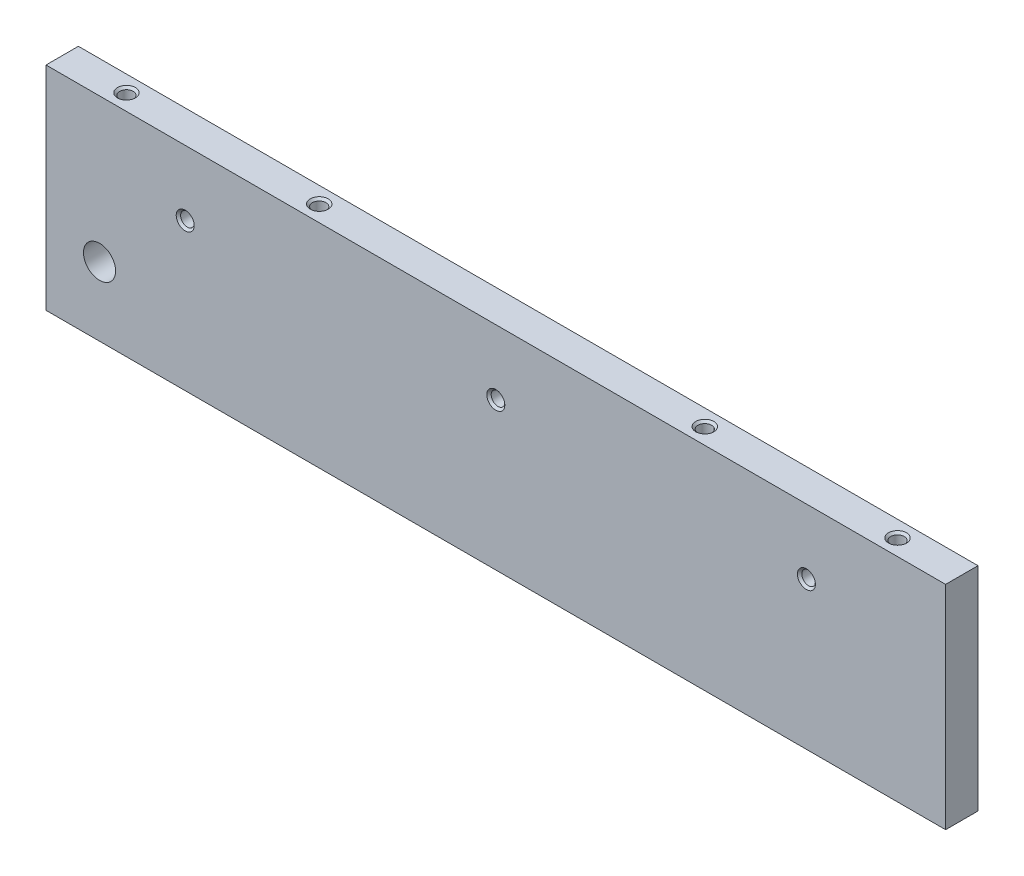
ISO-10303-21;
HEADER;
FILE_DESCRIPTION(('STEP AP214'),'2;1');
FILE_NAME('part.step','',(''),(''),'','','');
FILE_SCHEMA(('AUTOMOTIVE_DESIGN { 1 0 10303 214 1 1 1 1 }'));
ENDSEC;
DATA;
#1=APPLICATION_CONTEXT('core data for automotive mechanical design processes');
#2=APPLICATION_PROTOCOL_DEFINITION('international standard','automotive_design',2000,#1);
#3=PRODUCT_CONTEXT('',#1,'mechanical');
#4=PRODUCT('Part','Part','',(#3));
#5=PRODUCT_RELATED_PRODUCT_CATEGORY('part','',(#4));
#6=PRODUCT_DEFINITION_FORMATION('','',#4);
#7=PRODUCT_DEFINITION_CONTEXT('part definition',#1,'design');
#8=PRODUCT_DEFINITION('design','',#6,#7);
#9=PRODUCT_DEFINITION_SHAPE('','',#8);
#10=(LENGTH_UNIT() NAMED_UNIT(*) SI_UNIT(.MILLI.,.METRE.));
#11=(NAMED_UNIT(*) PLANE_ANGLE_UNIT() SI_UNIT($,.RADIAN.));
#12=(NAMED_UNIT(*) SI_UNIT($,.STERADIAN.) SOLID_ANGLE_UNIT());
#13=UNCERTAINTY_MEASURE_WITH_UNIT(LENGTH_MEASURE(1.E-05),#10,'distance_accuracy_value','');
#14=(GEOMETRIC_REPRESENTATION_CONTEXT(3) GLOBAL_UNCERTAINTY_ASSIGNED_CONTEXT((#13)) GLOBAL_UNIT_ASSIGNED_CONTEXT((#10,
#11,#12)) REPRESENTATION_CONTEXT('',''));
#15=CARTESIAN_POINT('',(0.,0.,0.));
#16=DIRECTION('',(0.,0.,1.));
#17=DIRECTION('',(1.,0.,0.));
#18=AXIS2_PLACEMENT_3D('',#15,#16,#17);
#19=CARTESIAN_POINT('',(-133.35,0.,9.6012));
#20=DIRECTION('',(1.,0.,0.));
#21=DIRECTION('',(0.,0.,-1.));
#22=AXIS2_PLACEMENT_3D('',#19,#20,#21);
#23=PLANE('',#22);
#24=DIRECTION('',(0.,-1.,0.));
#25=VECTOR('',#24,1.);
#26=CARTESIAN_POINT('',(-133.35,0.,0.));
#27=LINE('',#26,#25);
#28=CARTESIAN_POINT('',(-133.35,0.,0.));
#29=VERTEX_POINT('',#28);
#30=CARTESIAN_POINT('',(-133.35,-62.992,0.));
#31=VERTEX_POINT('',#30);
#32=EDGE_CURVE('E180',#29,#31,#27,.T.);
#33=ORIENTED_EDGE('',*,*,#32,.T.);
#34=DIRECTION('',(0.,0.,-1.));
#35=VECTOR('',#34,1.);
#36=CARTESIAN_POINT('',(-133.35,-62.992,9.6012));
#37=LINE('',#36,#35);
#38=CARTESIAN_POINT('',(-133.35,-62.992,9.6012));
#39=VERTEX_POINT('',#38);
#40=EDGE_CURVE('E11',#39,#31,#37,.T.);
#41=ORIENTED_EDGE('',*,*,#40,.F.);
#42=DIRECTION('',(0.,-1.,0.));
#43=VECTOR('',#42,1.);
#44=CARTESIAN_POINT('',(-133.35,0.,9.6012));
#45=LINE('',#44,#43);
#46=CARTESIAN_POINT('',(-133.35,0.,9.6012));
#47=VERTEX_POINT('',#46);
#48=EDGE_CURVE('E181',#47,#39,#45,.T.);
#49=ORIENTED_EDGE('',*,*,#48,.F.);
#50=DIRECTION('',(0.,0.,-1.));
#51=VECTOR('',#50,1.);
#52=CARTESIAN_POINT('',(-133.35,0.,9.6012));
#53=LINE('',#52,#51);
#54=EDGE_CURVE('E187',#47,#29,#53,.T.);
#55=ORIENTED_EDGE('',*,*,#54,.T.);
#56=EDGE_LOOP('',(#33,#41,#49,#55));
#57=FACE_BOUND('',#56,.T.);
#58=ADVANCED_FACE('F34',(#57),#23,.F.);
#59=CARTESIAN_POINT('',(-133.35,-62.992,9.6012));
#60=DIRECTION('',(0.,1.,0.));
#61=DIRECTION('',(0.,0.,1.));
#62=AXIS2_PLACEMENT_3D('',#59,#60,#61);
#63=PLANE('',#62);
#64=DIRECTION('',(1.,0.,0.));
#65=VECTOR('',#64,1.);
#66=CARTESIAN_POINT('',(-133.35,-62.992,0.));
#67=LINE('',#66,#65);
#68=CARTESIAN_POINT('',(133.35,-62.992,0.));
#69=VERTEX_POINT('',#68);
#70=EDGE_CURVE('E190',#31,#69,#67,.T.);
#71=ORIENTED_EDGE('',*,*,#70,.T.);
#72=DIRECTION('',(0.,0.,-1.));
#73=VECTOR('',#72,1.);
#74=CARTESIAN_POINT('',(133.35,-62.992,9.6012));
#75=LINE('',#74,#73);
#76=CARTESIAN_POINT('',(133.35,-62.992,9.6012));
#77=VERTEX_POINT('',#76);
#78=EDGE_CURVE('E42',#77,#69,#75,.T.);
#79=ORIENTED_EDGE('',*,*,#78,.F.);
#80=DIRECTION('',(1.,0.,0.));
#81=VECTOR('',#80,1.);
#82=CARTESIAN_POINT('',(-133.35,-62.992,9.6012));
#83=LINE('',#82,#81);
#84=EDGE_CURVE('E81',#39,#77,#83,.T.);
#85=ORIENTED_EDGE('',*,*,#84,.F.);
#86=ORIENTED_EDGE('',*,*,#40,.T.);
#87=EDGE_LOOP('',(#71,#79,#85,#86));
#88=FACE_BOUND('',#87,.T.);
#89=ADVANCED_FACE('F215',(#88),#63,.F.);
#90=CARTESIAN_POINT('',(133.35,0.,9.6012));
#91=DIRECTION('',(-1.,0.,0.));
#92=DIRECTION('',(0.,0.,1.));
#93=AXIS2_PLACEMENT_3D('',#90,#91,#92);
#94=PLANE('',#93);
#95=DIRECTION('',(0.,1.,0.));
#96=VECTOR('',#95,1.);
#97=CARTESIAN_POINT('',(133.35,0.,0.));
#98=LINE('',#97,#96);
#99=CARTESIAN_POINT('',(133.35,0.,0.));
#100=VERTEX_POINT('',#99);
#101=EDGE_CURVE('E68',#69,#100,#98,.T.);
#102=ORIENTED_EDGE('',*,*,#101,.T.);
#103=DIRECTION('',(0.,0.,-1.));
#104=VECTOR('',#103,1.);
#105=CARTESIAN_POINT('',(133.35,0.,9.6012));
#106=LINE('',#105,#104);
#107=CARTESIAN_POINT('',(133.35,0.,9.6012));
#108=VERTEX_POINT('',#107);
#109=EDGE_CURVE('E195',#108,#100,#106,.T.);
#110=ORIENTED_EDGE('',*,*,#109,.F.);
#111=DIRECTION('',(0.,1.,0.));
#112=VECTOR('',#111,1.);
#113=CARTESIAN_POINT('',(133.35,0.,9.6012));
#114=LINE('',#113,#112);
#115=EDGE_CURVE('E184',#77,#108,#114,.T.);
#116=ORIENTED_EDGE('',*,*,#115,.F.);
#117=ORIENTED_EDGE('',*,*,#78,.T.);
#118=EDGE_LOOP('',(#102,#110,#116,#117));
#119=FACE_BOUND('',#118,.T.);
#120=ADVANCED_FACE('F197',(#119),#94,.F.);
#121=CARTESIAN_POINT('',(-133.35,0.,9.6012));
#122=DIRECTION('',(0.,-1.,0.));
#123=DIRECTION('',(0.,0.,-1.));
#124=AXIS2_PLACEMENT_3D('',#121,#122,#123);
#125=PLANE('',#124);
#126=CARTESIAN_POINT('',(114.3,0.,4.8006));
#127=DIRECTION('',(0.,1.,0.));
#128=DIRECTION('',(0.,0.,1.));
#129=AXIS2_PLACEMENT_3D('',#126,#127,#128);
#130=CIRCLE('',#129,2.667);
#131=CARTESIAN_POINT('',(114.3,0.,7.4676));
#132=VERTEX_POINT('',#131);
#133=EDGE_CURVE('E111',#132,#132,#130,.T.);
#134=ORIENTED_EDGE('',*,*,#133,.F.);
#135=EDGE_LOOP('',(#134));
#136=FACE_BOUND('',#135,.T.);
#137=CARTESIAN_POINT('',(57.15,0.,4.8006));
#138=DIRECTION('',(0.,1.,0.));
#139=DIRECTION('',(0.,0.,1.));
#140=AXIS2_PLACEMENT_3D('',#137,#138,#139);
#141=CIRCLE('',#140,2.667);
#142=CARTESIAN_POINT('',(57.15,0.,7.4676));
#143=VERTEX_POINT('',#142);
#144=EDGE_CURVE('E104',#143,#143,#141,.T.);
#145=ORIENTED_EDGE('',*,*,#144,.F.);
#146=EDGE_LOOP('',(#145));
#147=FACE_BOUND('',#146,.T.);
#148=CARTESIAN_POINT('',(-57.15,0.,4.8006));
#149=DIRECTION('',(0.,1.,0.));
#150=DIRECTION('',(0.,0.,1.));
#151=AXIS2_PLACEMENT_3D('',#148,#149,#150);
#152=CIRCLE('',#151,2.667);
#153=CARTESIAN_POINT('',(-57.15,0.,7.4676));
#154=VERTEX_POINT('',#153);
#155=EDGE_CURVE('E120',#154,#154,#152,.T.);
#156=ORIENTED_EDGE('',*,*,#155,.F.);
#157=EDGE_LOOP('',(#156));
#158=FACE_BOUND('',#157,.T.);
#159=CARTESIAN_POINT('',(-114.3,0.,4.8006));
#160=DIRECTION('',(0.,1.,0.));
#161=DIRECTION('',(0.,0.,1.));
#162=AXIS2_PLACEMENT_3D('',#159,#160,#161);
#163=CIRCLE('',#162,2.667);
#164=CARTESIAN_POINT('',(-114.3,0.,7.4676));
#165=VERTEX_POINT('',#164);
#166=EDGE_CURVE('E129',#165,#165,#163,.T.);
#167=ORIENTED_EDGE('',*,*,#166,.F.);
#168=EDGE_LOOP('',(#167));
#169=FACE_BOUND('',#168,.T.);
#170=DIRECTION('',(-1.,0.,0.));
#171=VECTOR('',#170,1.);
#172=CARTESIAN_POINT('',(-133.35,0.,0.));
#173=LINE('',#172,#171);
#174=EDGE_CURVE('E74',#100,#29,#173,.T.);
#175=ORIENTED_EDGE('',*,*,#174,.T.);
#176=ORIENTED_EDGE('',*,*,#54,.F.);
#177=DIRECTION('',(-1.,0.,0.));
#178=VECTOR('',#177,1.);
#179=CARTESIAN_POINT('',(-133.35,0.,9.6012));
#180=LINE('',#179,#178);
#181=EDGE_CURVE('E50',#108,#47,#180,.T.);
#182=ORIENTED_EDGE('',*,*,#181,.F.);
#183=ORIENTED_EDGE('',*,*,#109,.T.);
#184=EDGE_LOOP('',(#175,#176,#182,#183));
#185=FACE_BOUND('',#184,.T.);
#186=ADVANCED_FACE('F204',(#136,#147,#158,#169,#185),#125,.F.);
#187=CARTESIAN_POINT('',(0.,0.,9.6012));
#188=DIRECTION('',(0.,0.,1.));
#189=DIRECTION('',(1.,0.,0.));
#190=AXIS2_PLACEMENT_3D('',#187,#188,#189);
#191=PLANE('',#190);
#192=CARTESIAN_POINT('',(-117.475,-42.5958,9.6012));
#193=DIRECTION('',(0.,0.,1.));
#194=DIRECTION('',(1.,0.,0.));
#195=AXIS2_PLACEMENT_3D('',#192,#193,#194);
#196=CIRCLE('',#195,4.76249999999999);
#197=CARTESIAN_POINT('',(-112.7125,-42.5958,9.6012));
#198=VERTEX_POINT('',#197);
#199=EDGE_CURVE('E138',#198,#198,#196,.T.);
#200=ORIENTED_EDGE('',*,*,#199,.F.);
#201=EDGE_LOOP('',(#200));
#202=FACE_BOUND('',#201,.T.);
#203=CARTESIAN_POINT('',(92.075,-19.304,9.6012));
#204=DIRECTION('',(0.,0.,1.));
#205=DIRECTION('',(1.,0.,0.));
#206=AXIS2_PLACEMENT_3D('',#203,#204,#205);
#207=CIRCLE('',#206,2.667);
#208=CARTESIAN_POINT('',(94.742,-19.304,9.6012));
#209=VERTEX_POINT('',#208);
#210=EDGE_CURVE('E147',#209,#209,#207,.T.);
#211=ORIENTED_EDGE('',*,*,#210,.F.);
#212=EDGE_LOOP('',(#211));
#213=FACE_BOUND('',#212,.T.);
#214=CARTESIAN_POINT('',(0.,-19.304,9.6012));
#215=DIRECTION('',(0.,0.,1.));
#216=DIRECTION('',(1.,0.,0.));
#217=AXIS2_PLACEMENT_3D('',#214,#215,#216);
#218=CIRCLE('',#217,2.667);
#219=CARTESIAN_POINT('',(2.667,-19.304,9.6012));
#220=VERTEX_POINT('',#219);
#221=EDGE_CURVE('E159',#220,#220,#218,.T.);
#222=ORIENTED_EDGE('',*,*,#221,.F.);
#223=EDGE_LOOP('',(#222));
#224=FACE_BOUND('',#223,.T.);
#225=CARTESIAN_POINT('',(-92.075,-19.304,9.6012));
#226=DIRECTION('',(0.,0.,1.));
#227=DIRECTION('',(1.,0.,0.));
#228=AXIS2_PLACEMENT_3D('',#225,#226,#227);
#229=CIRCLE('',#228,2.667);
#230=CARTESIAN_POINT('',(-89.408,-19.304,9.6012));
#231=VERTEX_POINT('',#230);
#232=EDGE_CURVE('E171',#231,#231,#229,.T.);
#233=ORIENTED_EDGE('',*,*,#232,.F.);
#234=EDGE_LOOP('',(#233));
#235=FACE_BOUND('',#234,.T.);
#236=ORIENTED_EDGE('',*,*,#48,.T.);
#237=ORIENTED_EDGE('',*,*,#84,.T.);
#238=ORIENTED_EDGE('',*,*,#115,.T.);
#239=ORIENTED_EDGE('',*,*,#181,.T.);
#240=EDGE_LOOP('',(#236,#237,#238,#239));
#241=FACE_BOUND('',#240,.T.);
#242=ADVANCED_FACE('F206',(#202,#213,#224,#235,#241),#191,.T.);
#243=CARTESIAN_POINT('',(0.,0.,0.));
#244=DIRECTION('',(0.,0.,1.));
#245=DIRECTION('',(1.,0.,0.));
#246=AXIS2_PLACEMENT_3D('',#243,#244,#245);
#247=PLANE('',#246);
#248=CARTESIAN_POINT('',(-117.475,-42.5958,0.));
#249=DIRECTION('',(0.,0.,1.));
#250=DIRECTION('',(1.,0.,0.));
#251=AXIS2_PLACEMENT_3D('',#248,#249,#250);
#252=CIRCLE('',#251,4.7625);
#253=CARTESIAN_POINT('',(-112.7125,-42.5958,0.));
#254=VERTEX_POINT('',#253);
#255=EDGE_CURVE('E141',#254,#254,#252,.T.);
#256=ORIENTED_EDGE('',*,*,#255,.T.);
#257=EDGE_LOOP('',(#256));
#258=FACE_BOUND('',#257,.T.);
#259=CARTESIAN_POINT('',(92.075,-19.304,0.));
#260=DIRECTION('',(0.,0.,1.));
#261=DIRECTION('',(1.,0.,0.));
#262=AXIS2_PLACEMENT_3D('',#259,#260,#261);
#263=CIRCLE('',#262,2.667);
#264=CARTESIAN_POINT('',(94.742,-19.304,0.));
#265=VERTEX_POINT('',#264);
#266=EDGE_CURVE('E144',#265,#265,#263,.T.);
#267=ORIENTED_EDGE('',*,*,#266,.T.);
#268=EDGE_LOOP('',(#267));
#269=FACE_BOUND('',#268,.T.);
#270=CARTESIAN_POINT('',(0.,-19.304,0.));
#271=DIRECTION('',(0.,0.,1.));
#272=DIRECTION('',(1.,0.,0.));
#273=AXIS2_PLACEMENT_3D('',#270,#271,#272);
#274=CIRCLE('',#273,2.667);
#275=CARTESIAN_POINT('',(2.667,-19.304,0.));
#276=VERTEX_POINT('',#275);
#277=EDGE_CURVE('E156',#276,#276,#274,.T.);
#278=ORIENTED_EDGE('',*,*,#277,.T.);
#279=EDGE_LOOP('',(#278));
#280=FACE_BOUND('',#279,.T.);
#281=CARTESIAN_POINT('',(-92.075,-19.304,0.));
#282=DIRECTION('',(0.,0.,1.));
#283=DIRECTION('',(1.,0.,0.));
#284=AXIS2_PLACEMENT_3D('',#281,#282,#283);
#285=CIRCLE('',#284,2.667);
#286=CARTESIAN_POINT('',(-89.408,-19.304,0.));
#287=VERTEX_POINT('',#286);
#288=EDGE_CURVE('E168',#287,#287,#285,.T.);
#289=ORIENTED_EDGE('',*,*,#288,.T.);
#290=EDGE_LOOP('',(#289));
#291=FACE_BOUND('',#290,.T.);
#292=ORIENTED_EDGE('',*,*,#32,.F.);
#293=ORIENTED_EDGE('',*,*,#174,.F.);
#294=ORIENTED_EDGE('',*,*,#101,.F.);
#295=ORIENTED_EDGE('',*,*,#70,.F.);
#296=EDGE_LOOP('',(#292,#293,#294,#295));
#297=FACE_BOUND('',#296,.T.);
#298=ADVANCED_FACE('F200',(#258,#269,#280,#291,#297),#247,.F.);
#299=CARTESIAN_POINT('',(-92.075,-19.304,0.647700000000003));
#300=DIRECTION('',(0.,0.,-1.));
#301=DIRECTION('',(-1.,0.,0.));
#302=AXIS2_PLACEMENT_3D('',#299,#300,#301);
#303=CONICAL_SURFACE('',#302,2.0193,0.785398163397448);
#304=ORIENTED_EDGE('',*,*,#288,.F.);
#305=EDGE_LOOP('',(#304));
#306=FACE_BOUND('',#305,.T.);
#307=CARTESIAN_POINT('',(-92.075,-19.304,0.647700000000003));
#308=DIRECTION('',(0.,0.,1.));
#309=DIRECTION('',(1.,0.,0.));
#310=AXIS2_PLACEMENT_3D('',#307,#308,#309);
#311=CIRCLE('',#310,2.0193);
#312=CARTESIAN_POINT('',(-90.0557,-19.304,0.647700000000003));
#313=VERTEX_POINT('',#312);
#314=EDGE_CURVE('E177',#313,#313,#311,.T.);
#315=ORIENTED_EDGE('',*,*,#314,.T.);
#316=EDGE_LOOP('',(#315));
#317=FACE_BOUND('',#316,.T.);
#318=ADVANCED_FACE('F236',(#306,#317),#303,.F.);
#319=CARTESIAN_POINT('',(-92.075,-19.304,9.6012));
#320=DIRECTION('',(0.,0.,1.));
#321=DIRECTION('',(1.,0.,0.));
#322=AXIS2_PLACEMENT_3D('',#319,#320,#321);
#323=CYLINDRICAL_SURFACE('',#322,2.0193);
#324=ORIENTED_EDGE('',*,*,#314,.F.);
#325=EDGE_LOOP('',(#324));
#326=FACE_BOUND('',#325,.T.);
#327=CARTESIAN_POINT('',(-92.075,-19.304,8.9535));
#328=DIRECTION('',(0.,0.,1.));
#329=DIRECTION('',(1.,0.,0.));
#330=AXIS2_PLACEMENT_3D('',#327,#328,#329);
#331=CIRCLE('',#330,2.0193);
#332=CARTESIAN_POINT('',(-90.0557,-19.304,8.9535));
#333=VERTEX_POINT('',#332);
#334=EDGE_CURVE('E174',#333,#333,#331,.T.);
#335=ORIENTED_EDGE('',*,*,#334,.T.);
#336=EDGE_LOOP('',(#335));
#337=FACE_BOUND('',#336,.T.);
#338=ADVANCED_FACE('F241',(#326,#337),#323,.F.);
#339=CARTESIAN_POINT('',(-92.075,-19.304,9.6012));
#340=DIRECTION('',(0.,0.,1.));
#341=DIRECTION('',(1.,0.,0.));
#342=AXIS2_PLACEMENT_3D('',#339,#340,#341);
#343=CONICAL_SURFACE('',#342,2.667,0.785398163397448);
#344=ORIENTED_EDGE('',*,*,#334,.F.);
#345=EDGE_LOOP('',(#344));
#346=FACE_BOUND('',#345,.T.);
#347=ORIENTED_EDGE('',*,*,#232,.T.);
#348=EDGE_LOOP('',(#347));
#349=FACE_BOUND('',#348,.T.);
#350=ADVANCED_FACE('F253',(#346,#349),#343,.F.);
#351=CARTESIAN_POINT('',(0.,-19.304,0.647700000000003));
#352=DIRECTION('',(0.,0.,-1.));
#353=DIRECTION('',(-1.,0.,0.));
#354=AXIS2_PLACEMENT_3D('',#351,#352,#353);
#355=CONICAL_SURFACE('',#354,2.0193,0.785398163397447);
#356=ORIENTED_EDGE('',*,*,#277,.F.);
#357=EDGE_LOOP('',(#356));
#358=FACE_BOUND('',#357,.T.);
#359=CARTESIAN_POINT('',(0.,-19.304,0.647700000000003));
#360=DIRECTION('',(0.,0.,1.));
#361=DIRECTION('',(1.,0.,0.));
#362=AXIS2_PLACEMENT_3D('',#359,#360,#361);
#363=CIRCLE('',#362,2.0193);
#364=CARTESIAN_POINT('',(2.0193,-19.304,0.647700000000003));
#365=VERTEX_POINT('',#364);
#366=EDGE_CURVE('E165',#365,#365,#363,.T.);
#367=ORIENTED_EDGE('',*,*,#366,.T.);
#368=EDGE_LOOP('',(#367));
#369=FACE_BOUND('',#368,.T.);
#370=ADVANCED_FACE('F263',(#358,#369),#355,.F.);
#371=CARTESIAN_POINT('',(0.,-19.304,9.6012));
#372=DIRECTION('',(0.,0.,1.));
#373=DIRECTION('',(1.,0.,0.));
#374=AXIS2_PLACEMENT_3D('',#371,#372,#373);
#375=CYLINDRICAL_SURFACE('',#374,2.0193);
#376=ORIENTED_EDGE('',*,*,#366,.F.);
#377=EDGE_LOOP('',(#376));
#378=FACE_BOUND('',#377,.T.);
#379=CARTESIAN_POINT('',(0.,-19.304,8.9535));
#380=DIRECTION('',(0.,0.,1.));
#381=DIRECTION('',(1.,0.,0.));
#382=AXIS2_PLACEMENT_3D('',#379,#380,#381);
#383=CIRCLE('',#382,2.0193);
#384=CARTESIAN_POINT('',(2.0193,-19.304,8.9535));
#385=VERTEX_POINT('',#384);
#386=EDGE_CURVE('E162',#385,#385,#383,.T.);
#387=ORIENTED_EDGE('',*,*,#386,.T.);
#388=EDGE_LOOP('',(#387));
#389=FACE_BOUND('',#388,.T.);
#390=ADVANCED_FACE('F273',(#378,#389),#375,.F.);
#391=CARTESIAN_POINT('',(0.,-19.304,9.6012));
#392=DIRECTION('',(0.,0.,1.));
#393=DIRECTION('',(1.,0.,0.));
#394=AXIS2_PLACEMENT_3D('',#391,#392,#393);
#395=CONICAL_SURFACE('',#394,2.667,0.785398163397448);
#396=ORIENTED_EDGE('',*,*,#386,.F.);
#397=EDGE_LOOP('',(#396));
#398=FACE_BOUND('',#397,.T.);
#399=ORIENTED_EDGE('',*,*,#221,.T.);
#400=EDGE_LOOP('',(#399));
#401=FACE_BOUND('',#400,.T.);
#402=ADVANCED_FACE('F283',(#398,#401),#395,.F.);
#403=CARTESIAN_POINT('',(92.075,-19.304,0.647700000000003));
#404=DIRECTION('',(0.,0.,-1.));
#405=DIRECTION('',(-1.,0.,0.));
#406=AXIS2_PLACEMENT_3D('',#403,#404,#405);
#407=CONICAL_SURFACE('',#406,2.0193,0.785398163397448);
#408=ORIENTED_EDGE('',*,*,#266,.F.);
#409=EDGE_LOOP('',(#408));
#410=FACE_BOUND('',#409,.T.);
#411=CARTESIAN_POINT('',(92.075,-19.304,0.647700000000003));
#412=DIRECTION('',(0.,0.,1.));
#413=DIRECTION('',(1.,0.,0.));
#414=AXIS2_PLACEMENT_3D('',#411,#412,#413);
#415=CIRCLE('',#414,2.0193);
#416=CARTESIAN_POINT('',(94.0943,-19.304,0.647700000000003));
#417=VERTEX_POINT('',#416);
#418=EDGE_CURVE('E153',#417,#417,#415,.T.);
#419=ORIENTED_EDGE('',*,*,#418,.T.);
#420=EDGE_LOOP('',(#419));
#421=FACE_BOUND('',#420,.T.);
#422=ADVANCED_FACE('F293',(#410,#421),#407,.F.);
#423=CARTESIAN_POINT('',(92.075,-19.304,9.6012));
#424=DIRECTION('',(0.,0.,1.));
#425=DIRECTION('',(1.,0.,0.));
#426=AXIS2_PLACEMENT_3D('',#423,#424,#425);
#427=CYLINDRICAL_SURFACE('',#426,2.0193);
#428=ORIENTED_EDGE('',*,*,#418,.F.);
#429=EDGE_LOOP('',(#428));
#430=FACE_BOUND('',#429,.T.);
#431=CARTESIAN_POINT('',(92.075,-19.304,8.9535));
#432=DIRECTION('',(0.,0.,1.));
#433=DIRECTION('',(1.,0.,0.));
#434=AXIS2_PLACEMENT_3D('',#431,#432,#433);
#435=CIRCLE('',#434,2.0193);
#436=CARTESIAN_POINT('',(94.0943,-19.304,8.9535));
#437=VERTEX_POINT('',#436);
#438=EDGE_CURVE('E150',#437,#437,#435,.T.);
#439=ORIENTED_EDGE('',*,*,#438,.T.);
#440=EDGE_LOOP('',(#439));
#441=FACE_BOUND('',#440,.T.);
#442=ADVANCED_FACE('F303',(#430,#441),#427,.F.);
#443=CARTESIAN_POINT('',(92.075,-19.304,9.6012));
#444=DIRECTION('',(0.,0.,1.));
#445=DIRECTION('',(1.,0.,0.));
#446=AXIS2_PLACEMENT_3D('',#443,#444,#445);
#447=CONICAL_SURFACE('',#446,2.667,0.785398163397448);
#448=ORIENTED_EDGE('',*,*,#438,.F.);
#449=EDGE_LOOP('',(#448));
#450=FACE_BOUND('',#449,.T.);
#451=ORIENTED_EDGE('',*,*,#210,.T.);
#452=EDGE_LOOP('',(#451));
#453=FACE_BOUND('',#452,.T.);
#454=ADVANCED_FACE('F313',(#450,#453),#447,.F.);
#455=CARTESIAN_POINT('',(-117.475,-42.5958,9.6012));
#456=DIRECTION('',(0.,0.,1.));
#457=DIRECTION('',(1.,0.,0.));
#458=AXIS2_PLACEMENT_3D('',#455,#456,#457);
#459=CYLINDRICAL_SURFACE('',#458,4.7625);
#460=ORIENTED_EDGE('',*,*,#255,.F.);
#461=EDGE_LOOP('',(#460));
#462=FACE_BOUND('',#461,.T.);
#463=ORIENTED_EDGE('',*,*,#199,.T.);
#464=EDGE_LOOP('',(#463));
#465=FACE_BOUND('',#464,.T.);
#466=ADVANCED_FACE('F323',(#462,#465),#459,.F.);
#467=CARTESIAN_POINT('',(-114.3,-19.05,4.8006));
#468=DIRECTION('',(0.,1.,0.));
#469=DIRECTION('',(0.,0.,1.));
#470=AXIS2_PLACEMENT_3D('',#467,#468,#469);
#471=CONICAL_SURFACE('',#470,2.0193,1.02974425867665);
#472=CARTESIAN_POINT('',(-114.3,-20.2633178480024,4.8006));
#473=VERTEX_POINT('',#472);
#474=VERTEX_LOOP('',#473);
#475=FACE_BOUND('',#474,.T.);
#476=CARTESIAN_POINT('',(-114.3,-19.05,4.8006));
#477=DIRECTION('',(0.,1.,0.));
#478=DIRECTION('',(0.,0.,1.));
#479=AXIS2_PLACEMENT_3D('',#476,#477,#478);
#480=CIRCLE('',#479,2.0193);
#481=CARTESIAN_POINT('',(-114.3,-19.05,6.8199));
#482=VERTEX_POINT('',#481);
#483=EDGE_CURVE('E135',#482,#482,#480,.T.);
#484=ORIENTED_EDGE('',*,*,#483,.T.);
#485=EDGE_LOOP('',(#484));
#486=FACE_BOUND('',#485,.T.);
#487=ADVANCED_FACE('F344',(#475,#486),#471,.F.);
#488=CARTESIAN_POINT('',(-114.3,0.,4.8006));
#489=DIRECTION('',(0.,1.,0.));
#490=DIRECTION('',(0.,0.,1.));
#491=AXIS2_PLACEMENT_3D('',#488,#489,#490);
#492=CYLINDRICAL_SURFACE('',#491,2.0193);
#493=ORIENTED_EDGE('',*,*,#483,.F.);
#494=EDGE_LOOP('',(#493));
#495=FACE_BOUND('',#494,.T.);
#496=CARTESIAN_POINT('',(-114.3,-0.647700000000001,4.8006));
#497=DIRECTION('',(0.,1.,0.));
#498=DIRECTION('',(0.,0.,1.));
#499=AXIS2_PLACEMENT_3D('',#496,#497,#498);
#500=CIRCLE('',#499,2.0193);
#501=CARTESIAN_POINT('',(-114.3,-0.647700000000001,6.8199));
#502=VERTEX_POINT('',#501);
#503=EDGE_CURVE('E132',#502,#502,#500,.T.);
#504=ORIENTED_EDGE('',*,*,#503,.T.);
#505=EDGE_LOOP('',(#504));
#506=FACE_BOUND('',#505,.T.);
#507=ADVANCED_FACE('F358',(#495,#506),#492,.F.);
#508=CARTESIAN_POINT('',(-114.3,0.,4.8006));
#509=DIRECTION('',(0.,1.,0.));
#510=DIRECTION('',(0.,0.,1.));
#511=AXIS2_PLACEMENT_3D('',#508,#509,#510);
#512=CONICAL_SURFACE('',#511,2.667,0.785398163397447);
#513=ORIENTED_EDGE('',*,*,#503,.F.);
#514=EDGE_LOOP('',(#513));
#515=FACE_BOUND('',#514,.T.);
#516=ORIENTED_EDGE('',*,*,#166,.T.);
#517=EDGE_LOOP('',(#516));
#518=FACE_BOUND('',#517,.T.);
#519=ADVANCED_FACE('F368',(#515,#518),#512,.F.);
#520=CARTESIAN_POINT('',(-57.15,-19.05,4.8006));
#521=DIRECTION('',(0.,1.,0.));
#522=DIRECTION('',(0.,0.,1.));
#523=AXIS2_PLACEMENT_3D('',#520,#521,#522);
#524=CONICAL_SURFACE('',#523,2.01929999999999,1.02974425867665);
#525=CARTESIAN_POINT('',(-57.15,-20.2633178480024,4.8006));
#526=VERTEX_POINT('',#525);
#527=VERTEX_LOOP('',#526);
#528=FACE_BOUND('',#527,.T.);
#529=CARTESIAN_POINT('',(-57.15,-19.05,4.8006));
#530=DIRECTION('',(0.,1.,0.));
#531=DIRECTION('',(0.,0.,1.));
#532=AXIS2_PLACEMENT_3D('',#529,#530,#531);
#533=CIRCLE('',#532,2.01929999999999);
#534=CARTESIAN_POINT('',(-57.15,-19.05,6.81989999999999));
#535=VERTEX_POINT('',#534);
#536=EDGE_CURVE('E126',#535,#535,#533,.T.);
#537=ORIENTED_EDGE('',*,*,#536,.T.);
#538=EDGE_LOOP('',(#537));
#539=FACE_BOUND('',#538,.T.);
#540=ADVANCED_FACE('F378',(#528,#539),#524,.F.);
#541=CARTESIAN_POINT('',(-57.15,0.,4.8006));
#542=DIRECTION('',(0.,1.,0.));
#543=DIRECTION('',(0.,0.,1.));
#544=AXIS2_PLACEMENT_3D('',#541,#542,#543);
#545=CYLINDRICAL_SURFACE('',#544,2.01929999999999);
#546=ORIENTED_EDGE('',*,*,#536,.F.);
#547=EDGE_LOOP('',(#546));
#548=FACE_BOUND('',#547,.T.);
#549=CARTESIAN_POINT('',(-57.15,-0.647700000000001,4.8006));
#550=DIRECTION('',(0.,1.,0.));
#551=DIRECTION('',(0.,0.,1.));
#552=AXIS2_PLACEMENT_3D('',#549,#550,#551);
#553=CIRCLE('',#552,2.01929999999999);
#554=CARTESIAN_POINT('',(-57.15,-0.647700000000001,6.81989999999999));
#555=VERTEX_POINT('',#554);
#556=EDGE_CURVE('E123',#555,#555,#553,.T.);
#557=ORIENTED_EDGE('',*,*,#556,.T.);
#558=EDGE_LOOP('',(#557));
#559=FACE_BOUND('',#558,.T.);
#560=ADVANCED_FACE('F388',(#548,#559),#545,.F.);
#561=CARTESIAN_POINT('',(-57.15,0.,4.8006));
#562=DIRECTION('',(0.,1.,0.));
#563=DIRECTION('',(0.,0.,1.));
#564=AXIS2_PLACEMENT_3D('',#561,#562,#563);
#565=CONICAL_SURFACE('',#564,2.667,0.785398163397447);
#566=ORIENTED_EDGE('',*,*,#556,.F.);
#567=EDGE_LOOP('',(#566));
#568=FACE_BOUND('',#567,.T.);
#569=ORIENTED_EDGE('',*,*,#155,.T.);
#570=EDGE_LOOP('',(#569));
#571=FACE_BOUND('',#570,.T.);
#572=ADVANCED_FACE('F398',(#568,#571),#565,.F.);
#573=CARTESIAN_POINT('',(57.15,-19.05,4.8006));
#574=DIRECTION('',(0.,1.,0.));
#575=DIRECTION('',(0.,0.,1.));
#576=AXIS2_PLACEMENT_3D('',#573,#574,#575);
#577=CONICAL_SURFACE('',#576,2.01929999999999,1.02974425867665);
#578=CARTESIAN_POINT('',(57.15,-20.2633178480024,4.8006));
#579=VERTEX_POINT('',#578);
#580=VERTEX_LOOP('',#579);
#581=FACE_BOUND('',#580,.T.);
#582=CARTESIAN_POINT('',(57.15,-19.05,4.8006));
#583=DIRECTION('',(0.,1.,0.));
#584=DIRECTION('',(0.,0.,1.));
#585=AXIS2_PLACEMENT_3D('',#582,#583,#584);
#586=CIRCLE('',#585,2.01929999999999);
#587=CARTESIAN_POINT('',(57.15,-19.05,6.81989999999999));
#588=VERTEX_POINT('',#587);
#589=EDGE_CURVE('E117',#588,#588,#586,.T.);
#590=ORIENTED_EDGE('',*,*,#589,.T.);
#591=EDGE_LOOP('',(#590));
#592=FACE_BOUND('',#591,.T.);
#593=ADVANCED_FACE('F408',(#581,#592),#577,.F.);
#594=CARTESIAN_POINT('',(57.15,0.,4.8006));
#595=DIRECTION('',(0.,1.,0.));
#596=DIRECTION('',(0.,0.,1.));
#597=AXIS2_PLACEMENT_3D('',#594,#595,#596);
#598=CYLINDRICAL_SURFACE('',#597,2.01929999999999);
#599=ORIENTED_EDGE('',*,*,#589,.F.);
#600=EDGE_LOOP('',(#599));
#601=FACE_BOUND('',#600,.T.);
#602=CARTESIAN_POINT('',(57.15,-0.647700000000001,4.8006));
#603=DIRECTION('',(0.,1.,0.));
#604=DIRECTION('',(0.,0.,1.));
#605=AXIS2_PLACEMENT_3D('',#602,#603,#604);
#606=CIRCLE('',#605,2.01929999999999);
#607=CARTESIAN_POINT('',(57.15,-0.647700000000001,6.81989999999999));
#608=VERTEX_POINT('',#607);
#609=EDGE_CURVE('E108',#608,#608,#606,.T.);
#610=ORIENTED_EDGE('',*,*,#609,.T.);
#611=EDGE_LOOP('',(#610));
#612=FACE_BOUND('',#611,.T.);
#613=ADVANCED_FACE('F418',(#601,#612),#598,.F.);
#614=CARTESIAN_POINT('',(57.15,0.,4.8006));
#615=DIRECTION('',(0.,1.,0.));
#616=DIRECTION('',(0.,0.,1.));
#617=AXIS2_PLACEMENT_3D('',#614,#615,#616);
#618=CONICAL_SURFACE('',#617,2.667,0.785398163397447);
#619=ORIENTED_EDGE('',*,*,#609,.F.);
#620=EDGE_LOOP('',(#619));
#621=FACE_BOUND('',#620,.T.);
#622=ORIENTED_EDGE('',*,*,#144,.T.);
#623=EDGE_LOOP('',(#622));
#624=FACE_BOUND('',#623,.T.);
#625=ADVANCED_FACE('F98',(#621,#624),#618,.F.);
#626=CARTESIAN_POINT('',(114.3,-19.05,4.8006));
#627=DIRECTION('',(0.,1.,0.));
#628=DIRECTION('',(0.,0.,1.));
#629=AXIS2_PLACEMENT_3D('',#626,#627,#628);
#630=CONICAL_SURFACE('',#629,2.0193,1.02974425867665);
#631=CARTESIAN_POINT('',(114.3,-20.2633178480024,4.8006));
#632=VERTEX_POINT('',#631);
#633=VERTEX_LOOP('',#632);
#634=FACE_BOUND('',#633,.T.);
#635=CARTESIAN_POINT('',(114.3,-19.05,4.8006));
#636=DIRECTION('',(0.,1.,0.));
#637=DIRECTION('',(0.,0.,1.));
#638=AXIS2_PLACEMENT_3D('',#635,#636,#637);
#639=CIRCLE('',#638,2.0193);
#640=CARTESIAN_POINT('',(114.3,-19.05,6.8199));
#641=VERTEX_POINT('',#640);
#642=EDGE_CURVE('E102',#641,#641,#639,.T.);
#643=ORIENTED_EDGE('',*,*,#642,.T.);
#644=EDGE_LOOP('',(#643));
#645=FACE_BOUND('',#644,.T.);
#646=ADVANCED_FACE('F94',(#634,#645),#630,.F.);
#647=CARTESIAN_POINT('',(114.3,0.,4.8006));
#648=DIRECTION('',(0.,1.,0.));
#649=DIRECTION('',(0.,0.,1.));
#650=AXIS2_PLACEMENT_3D('',#647,#648,#649);
#651=CYLINDRICAL_SURFACE('',#650,2.0193);
#652=ORIENTED_EDGE('',*,*,#642,.F.);
#653=EDGE_LOOP('',(#652));
#654=FACE_BOUND('',#653,.T.);
#655=CARTESIAN_POINT('',(114.3,-0.647700000000001,4.8006));
#656=DIRECTION('',(0.,1.,0.));
#657=DIRECTION('',(0.,0.,1.));
#658=AXIS2_PLACEMENT_3D('',#655,#656,#657);
#659=CIRCLE('',#658,2.0193);
#660=CARTESIAN_POINT('',(114.3,-0.647700000000001,6.8199));
#661=VERTEX_POINT('',#660);
#662=EDGE_CURVE('E105',#661,#661,#659,.T.);
#663=ORIENTED_EDGE('',*,*,#662,.T.);
#664=EDGE_LOOP('',(#663));
#665=FACE_BOUND('',#664,.T.);
#666=ADVANCED_FACE('F97',(#654,#665),#651,.F.);
#667=CARTESIAN_POINT('',(114.3,0.,4.8006));
#668=DIRECTION('',(0.,1.,0.));
#669=DIRECTION('',(0.,0.,1.));
#670=AXIS2_PLACEMENT_3D('',#667,#668,#669);
#671=CONICAL_SURFACE('',#670,2.667,0.785398163397447);
#672=ORIENTED_EDGE('',*,*,#662,.F.);
#673=EDGE_LOOP('',(#672));
#674=FACE_BOUND('',#673,.T.);
#675=ORIENTED_EDGE('',*,*,#133,.T.);
#676=EDGE_LOOP('',(#675));
#677=FACE_BOUND('',#676,.T.);
#678=ADVANCED_FACE('F452',(#674,#677),#671,.F.);
#679=CLOSED_SHELL('',(#58,#89,#120,#186,#242,#298,#318,#338,#350,#370,#390,#402,#422,#442,#454,
#466,#487,#507,#519,#540,#560,#572,#593,#613,#625,#646,#666,#678));
#680=MANIFOLD_SOLID_BREP('B2',#679);
#681=ADVANCED_BREP_SHAPE_REPRESENTATION('',(#18,#680),#14);
#682=SHAPE_DEFINITION_REPRESENTATION(#9,#681);
ENDSEC;
END-ISO-10303-21;
